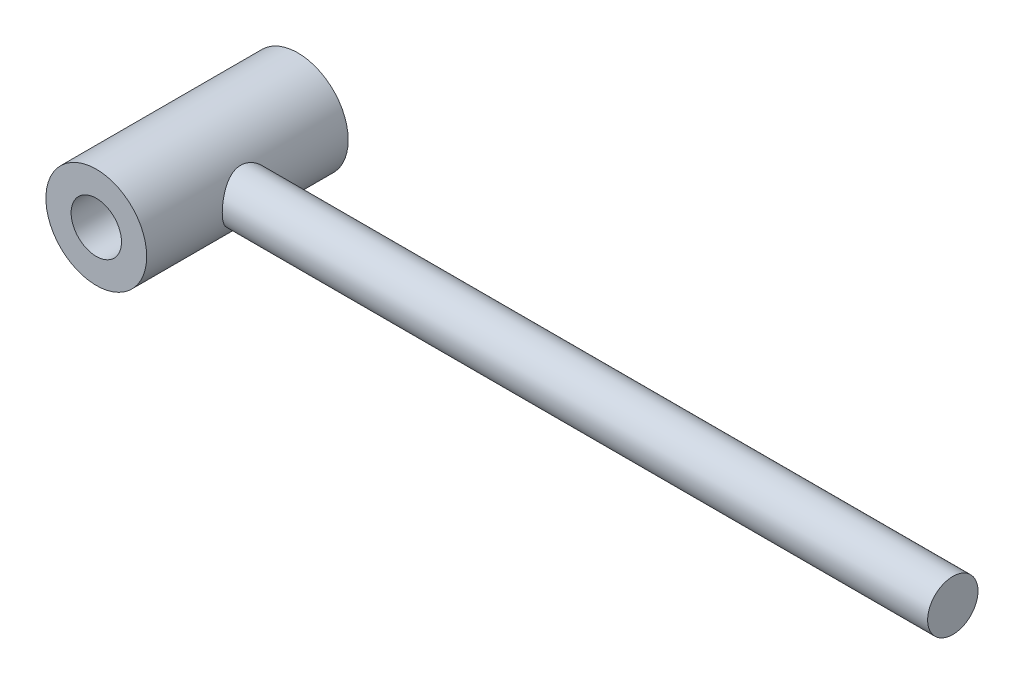
ISO-10303-21;
HEADER;
FILE_DESCRIPTION(('STEP AP214'),'2;1');
FILE_NAME('part.step','',(''),(''),'','','');
FILE_SCHEMA(('AUTOMOTIVE_DESIGN { 1 0 10303 214 1 1 1 1 }'));
ENDSEC;
DATA;
#1=APPLICATION_CONTEXT('core data for automotive mechanical design processes');
#2=APPLICATION_PROTOCOL_DEFINITION('international standard','automotive_design',2000,#1);
#3=PRODUCT_CONTEXT('',#1,'mechanical');
#4=PRODUCT('Part','Part','',(#3));
#5=PRODUCT_RELATED_PRODUCT_CATEGORY('part','',(#4));
#6=PRODUCT_DEFINITION_FORMATION('','',#4);
#7=PRODUCT_DEFINITION_CONTEXT('part definition',#1,'design');
#8=PRODUCT_DEFINITION('design','',#6,#7);
#9=PRODUCT_DEFINITION_SHAPE('','',#8);
#10=(LENGTH_UNIT() NAMED_UNIT(*) SI_UNIT(.MILLI.,.METRE.));
#11=(NAMED_UNIT(*) PLANE_ANGLE_UNIT() SI_UNIT($,.RADIAN.));
#12=(NAMED_UNIT(*) SI_UNIT($,.STERADIAN.) SOLID_ANGLE_UNIT());
#13=UNCERTAINTY_MEASURE_WITH_UNIT(LENGTH_MEASURE(1.E-05),#10,'distance_accuracy_value','');
#14=(GEOMETRIC_REPRESENTATION_CONTEXT(3) GLOBAL_UNCERTAINTY_ASSIGNED_CONTEXT((#13)) GLOBAL_UNIT_ASSIGNED_CONTEXT((#10,
#11,#12)) REPRESENTATION_CONTEXT('',''));
#15=CARTESIAN_POINT('',(0.,0.,0.));
#16=DIRECTION('',(0.,0.,1.));
#17=DIRECTION('',(1.,0.,0.));
#18=AXIS2_PLACEMENT_3D('',#15,#16,#17);
#19=CARTESIAN_POINT('',(0.,0.,20.));
#20=DIRECTION('',(0.,0.,-1.));
#21=DIRECTION('',(-1.,0.,0.));
#22=AXIS2_PLACEMENT_3D('',#19,#20,#21);
#23=CYLINDRICAL_SURFACE('',#22,5.);
#24=CARTESIAN_POINT('',(0.,0.,0.));
#25=DIRECTION('',(0.,0.,1.));
#26=DIRECTION('',(1.,0.,0.));
#27=AXIS2_PLACEMENT_3D('',#24,#25,#26);
#28=CIRCLE('',#27,5.);
#29=CARTESIAN_POINT('',(5.,0.,0.));
#30=VERTEX_POINT('',#29);
#31=EDGE_CURVE('E45',#30,#30,#28,.T.);
#32=ORIENTED_EDGE('',*,*,#31,.T.);
#33=EDGE_LOOP('',(#32));
#34=FACE_BOUND('',#33,.T.);
#35=CARTESIAN_POINT('',(0.,0.,20.));
#36=DIRECTION('',(0.,0.,1.));
#37=DIRECTION('',(1.,0.,0.));
#38=AXIS2_PLACEMENT_3D('',#35,#36,#37);
#39=CIRCLE('',#38,5.);
#40=CARTESIAN_POINT('',(5.,0.,20.));
#41=VERTEX_POINT('',#40);
#42=EDGE_CURVE('E41',#41,#41,#39,.T.);
#43=ORIENTED_EDGE('',*,*,#42,.F.);
#44=EDGE_LOOP('',(#43));
#45=FACE_BOUND('',#44,.T.);
#46=CARTESIAN_POINT('',(5.,0.,12.5));
#47=CARTESIAN_POINT('',(4.99999177550472,-0.131426682334305,12.499990330944));
#48=CARTESIAN_POINT('',(4.99476199135277,-0.263015634437212,12.489574438226));
#49=CARTESIAN_POINT('',(4.9743541856102,-0.522301454622883,12.4483681788379));
#50=CARTESIAN_POINT('',(4.9591572718767,-0.649990448564105,12.417539119075));
#51=CARTESIAN_POINT('',(4.92040690922477,-0.897333631316203,12.3370153772812));
#52=CARTESIAN_POINT('',(4.89688595907259,-1.01701694536277,12.2873940122173));
#53=CARTESIAN_POINT('',(4.84364443325827,-1.24618160399671,12.1710734737482));
#54=CARTESIAN_POINT('',(4.81392434644421,-1.3556637520377,12.1043756468549));
#55=CARTESIAN_POINT('',(4.74890645050632,-1.56876952630998,11.9512068683574));
#56=CARTESIAN_POINT('',(4.71337997659091,-1.67163802294308,11.8637837997702));
#57=CARTESIAN_POINT('',(4.64149925776731,-1.86194861703333,11.6736963040147));
#58=CARTESIAN_POINT('',(4.60514440566897,-1.94937895911555,11.5710203711599));
#59=CARTESIAN_POINT('',(4.53247377945622,-2.11312999967247,11.3437916255547));
#60=CARTESIAN_POINT('',(4.49637967412567,-2.18806333849064,11.218159753965));
#61=CARTESIAN_POINT('',(4.43214946943555,-2.31542056761491,10.9540816602046));
#62=CARTESIAN_POINT('',(4.40400769020792,-2.36786053751682,10.8156446782374));
#63=CARTESIAN_POINT('',(4.36144667591402,-2.44533110537653,10.5383372364036));
#64=CARTESIAN_POINT('',(4.34630678958452,-2.47181464267578,10.3999888698204));
#65=CARTESIAN_POINT('',(4.3295472487215,-2.50106748329741,10.1200529055624));
#66=CARTESIAN_POINT('',(4.3279142335843,-2.50386022093906,9.97846864782491));
#67=CARTESIAN_POINT('',(4.33777325642937,-2.48671821792512,9.71428493920912));
#68=CARTESIAN_POINT('',(4.34771909154984,-2.46946139884055,9.59143992194172));
#69=CARTESIAN_POINT('',(4.37690571834675,-2.41734962264384,9.35069522656806));
#70=CARTESIAN_POINT('',(4.39614947079454,-2.38248905974454,9.23279713673689));
#71=CARTESIAN_POINT('',(4.44218691031839,-2.29552445096459,9.00192716858567));
#72=CARTESIAN_POINT('',(4.46914601659993,-2.24303766778987,8.88913400303548));
#73=CARTESIAN_POINT('',(4.52758510703513,-2.12260421917012,8.67341426852503));
#74=CARTESIAN_POINT('',(4.55906711950478,-2.0546506095312,8.57049216099979));
#75=CARTESIAN_POINT('',(4.62782894758213,-1.89516513728194,8.36369686814192));
#76=CARTESIAN_POINT('',(4.66533775591865,-1.8017361459232,8.2613578160596));
#77=CARTESIAN_POINT('',(4.73869058251019,-1.59888894685344,8.07316145352275));
#78=CARTESIAN_POINT('',(4.77453379897003,-1.48946314143571,7.9873120199153));
#79=CARTESIAN_POINT('',(4.84254968207409,-1.25129126457962,7.83078584742568));
#80=CARTESIAN_POINT('',(4.87447460405015,-1.12188397899853,7.76099881888564));
#81=CARTESIAN_POINT('',(4.92894702803109,-0.851165538721985,7.64475742739248));
#82=CARTESIAN_POINT('',(4.95150197358893,-0.709863940663162,7.5982845374621));
#83=CARTESIAN_POINT('',(4.98310834353579,-0.431916229151781,7.5338114907083));
#84=CARTESIAN_POINT('',(4.9931234575324,-0.295853826370906,7.513771910633));
#85=CARTESIAN_POINT('',(5.00182533647794,-0.021948999873288,7.49633817216383));
#86=CARTESIAN_POINT('',(5.00051746803426,0.115892549675109,7.49893328590151));
#87=CARTESIAN_POINT('',(4.98727980633468,0.378082429964657,7.5255167210467));
#88=CARTESIAN_POINT('',(4.97618114219992,0.502648520123707,7.54783133182441));
#89=CARTESIAN_POINT('',(4.94555428287529,0.746017230755972,7.61059517973838));
#90=CARTESIAN_POINT('',(4.92602515837625,0.864819214231883,7.65104641613589));
#91=CARTESIAN_POINT('',(4.87960628532329,1.09722152111965,7.74999616608036));
#92=CARTESIAN_POINT('',(4.85252204417873,1.21057599249831,7.80897762528232));
#93=CARTESIAN_POINT('',(4.7935993579975,1.42615340426439,7.94276883912482));
#94=CARTESIAN_POINT('',(4.76175888940534,1.52837157450203,8.01758533651988));
#95=CARTESIAN_POINT('',(4.69270553315087,1.72941922315487,8.18940106329089));
#96=CARTESIAN_POINT('',(4.65527212009488,1.82693019428496,8.2878571709752));
#97=CARTESIAN_POINT('',(4.58155978921587,2.0046408025722,8.49981287804944));
#98=CARTESIAN_POINT('',(4.54528168472407,2.08482846428685,8.61332279706986));
#99=CARTESIAN_POINT('',(4.4762798054528,2.22926978618995,8.85910913548465));
#100=CARTESIAN_POINT('',(4.44381323981254,2.29256373922243,8.99202816529114));
#101=CARTESIAN_POINT('',(4.38935180726746,2.39520706511459,9.26877516888255));
#102=CARTESIAN_POINT('',(4.36734345549014,2.43458729077055,9.41258881599999));
#103=CARTESIAN_POINT('',(4.33903752569351,2.48465421767005,9.69227555736294));
#104=CARTESIAN_POINT('',(4.33143458674096,2.4977324874436,9.82758563411897));
#105=CARTESIAN_POINT('',(4.32913386592579,2.50172288950898,10.0986176673807));
#106=CARTESIAN_POINT('',(4.33443049025111,2.49264462983266,10.2343394198736));
#107=CARTESIAN_POINT('',(4.35594655164663,2.45481530197332,10.4887087556169));
#108=CARTESIAN_POINT('',(4.37107736338133,2.42802074302696,10.6077511817208));
#109=CARTESIAN_POINT('',(4.40927540337602,2.35793843840544,10.8395202922));
#110=CARTESIAN_POINT('',(4.43234518434965,2.31464538728732,10.9522449315665));
#111=CARTESIAN_POINT('',(4.48571326433413,2.20953919315538,11.1765621527197));
#112=CARTESIAN_POINT('',(4.5163930799845,2.14667719009403,11.287569851735));
#113=CARTESIAN_POINT('',(4.58088327077455,2.0053780838799,11.49818624324));
#114=CARTESIAN_POINT('',(4.61469526970767,1.92693287765888,11.5977889626287));
#115=CARTESIAN_POINT('',(4.68655816327011,1.74550556946065,11.7953553637496));
#116=CARTESIAN_POINT('',(4.7246249151498,1.6407002246921,11.8916493641714));
#117=CARTESIAN_POINT('',(4.79694347383545,1.41539785420684,12.065655849428));
#118=CARTESIAN_POINT('',(4.83119321905446,1.29489242426332,12.1433583186059));
#119=CARTESIAN_POINT('',(4.89245149457782,1.03978808878536,12.2780969794841));
#120=CARTESIAN_POINT('',(4.91940711437488,0.905095560782288,12.3349831677845));
#121=CARTESIAN_POINT('',(4.95177960923351,0.696328709257351,12.4021838587924));
#122=CARTESIAN_POINT('',(4.96122314081874,0.625670413494087,12.4215553980018));
#123=CARTESIAN_POINT('',(4.97717127275101,0.482623997839256,12.4540659483706));
#124=CARTESIAN_POINT('',(4.98367766823159,0.4102369630924,12.4672087666764));
#125=CARTESIAN_POINT('',(4.9923820076613,0.28151868462167,12.4847374722846));
#126=CARTESIAN_POINT('',(4.99523288466454,0.225408499555443,12.4904549365313));
#127=CARTESIAN_POINT('',(4.99904367329659,0.112875528456288,12.4980883294657));
#128=CARTESIAN_POINT('',(5.00000353273198,0.0564527338382175,12.5000041532255));
#129=CARTESIAN_POINT('',(5.,0.,12.5));
#130=B_SPLINE_CURVE_WITH_KNOTS('',3,(#46,#47,#48,#49,#50,#51,#52,#53,#54,#55,#56,#57,#58,#59,
#60,#61,#62,#63,#64,#65,#66,#67,#68,#69,#70,#71,#72,#73,#74,#75,#76,#77,#78,#79,#80,#81,#82,#83,
#84,#85,#86,#87,#88,#89,#90,#91,#92,#93,#94,#95,#96,#97,#98,#99,#100,#101,#102,#103,#104,#105,
#106,#107,#108,#109,#110,#111,#112,#113,#114,#115,#116,#117,#118,#119,#120,#121,#122,#123,#124,
#125,#126,#127,#128,#129),.UNSPECIFIED.,.T.,.F.,(4,2,2,2,2,2,2,2,2,2,2,2,2,2,2,2,2,2,2,2,2,2,2,
2,2,2,2,2,2,2,2,2,2,2,2,2,2,2,2,2,2,4),(0.,0.394060643550731,0.788870374272994,1.18215538873075,
1.57540940145392,1.99245439679522,2.40981559413509,2.85954316076882,3.30894869745702,
3.73145030350574,4.15353393322551,4.52514281023301,4.89687009814196,5.27725600421218,
5.65781303150554,6.08662353334696,6.51563836496716,6.96457555536102,7.41315542280699,
7.82458226178364,8.2358141127869,8.61517266265305,8.99457304077329,9.38482140069747,
9.77523626870848,10.2039902661037,10.6330397153795,11.0828670540368,11.53211279863,
11.9382326875699,12.3441764966107,12.7114482562151,13.0788382197025,13.4709114195009,
13.8631890285845,14.303131068923,14.7433095845248,15.1866003415819,15.407934939208,
15.6291340766843,15.7983933645035,15.9676573239323),.UNSPECIFIED.);
#131=CARTESIAN_POINT('',(5.,0.,12.5));
#132=VERTEX_POINT('',#131);
#133=EDGE_CURVE('E10',#132,#132,#130,.T.);
#134=ORIENTED_EDGE('',*,*,#133,.F.);
#135=EDGE_LOOP('',(#134));
#136=FACE_BOUND('',#135,.T.);
#137=ADVANCED_FACE('F31',(#34,#45,#136),#23,.T.);
#138=CARTESIAN_POINT('',(0.,0.,20.));
#139=DIRECTION('',(0.,0.,1.));
#140=DIRECTION('',(1.,0.,0.));
#141=AXIS2_PLACEMENT_3D('',#138,#139,#140);
#142=PLANE('',#141);
#143=ORIENTED_EDGE('',*,*,#42,.T.);
#144=EDGE_LOOP('',(#143));
#145=FACE_BOUND('',#144,.T.);
#146=CARTESIAN_POINT('',(0.,0.,20.));
#147=DIRECTION('',(0.,0.,1.));
#148=DIRECTION('',(1.,0.,0.));
#149=AXIS2_PLACEMENT_3D('',#146,#147,#148);
#150=CIRCLE('',#149,2.5);
#151=CARTESIAN_POINT('',(2.5,0.,20.));
#152=VERTEX_POINT('',#151);
#153=EDGE_CURVE('E50',#152,#152,#150,.T.);
#154=ORIENTED_EDGE('',*,*,#153,.F.);
#155=EDGE_LOOP('',(#154));
#156=FACE_BOUND('',#155,.T.);
#157=ADVANCED_FACE('F76',(#145,#156),#142,.T.);
#158=CARTESIAN_POINT('',(0.,0.,0.));
#159=DIRECTION('',(0.,0.,1.));
#160=DIRECTION('',(1.,0.,0.));
#161=AXIS2_PLACEMENT_3D('',#158,#159,#160);
#162=PLANE('',#161);
#163=ORIENTED_EDGE('',*,*,#31,.F.);
#164=EDGE_LOOP('',(#163));
#165=FACE_BOUND('',#164,.T.);
#166=CARTESIAN_POINT('',(0.,0.,0.));
#167=DIRECTION('',(0.,0.,1.));
#168=DIRECTION('',(1.,0.,0.));
#169=AXIS2_PLACEMENT_3D('',#166,#167,#168);
#170=CIRCLE('',#169,2.5);
#171=CARTESIAN_POINT('',(2.5,0.,0.));
#172=VERTEX_POINT('',#171);
#173=EDGE_CURVE('E52',#172,#172,#170,.T.);
#174=ORIENTED_EDGE('',*,*,#173,.T.);
#175=EDGE_LOOP('',(#174));
#176=FACE_BOUND('',#175,.T.);
#177=ADVANCED_FACE('F71',(#165,#176),#162,.F.);
#178=CARTESIAN_POINT('',(0.,0.,20.));
#179=DIRECTION('',(0.,0.,-1.));
#180=DIRECTION('',(-1.,0.,0.));
#181=AXIS2_PLACEMENT_3D('',#178,#179,#180);
#182=CYLINDRICAL_SURFACE('',#181,2.5);
#183=ORIENTED_EDGE('',*,*,#153,.T.);
#184=EDGE_LOOP('',(#183));
#185=FACE_BOUND('',#184,.T.);
#186=ORIENTED_EDGE('',*,*,#173,.F.);
#187=EDGE_LOOP('',(#186));
#188=FACE_BOUND('',#187,.T.);
#189=ADVANCED_FACE('F65',(#185,#188),#182,.F.);
#190=CARTESIAN_POINT('',(75.,0.,10.));
#191=DIRECTION('',(-1.,0.,0.));
#192=DIRECTION('',(0.,0.,1.));
#193=AXIS2_PLACEMENT_3D('',#190,#191,#192);
#194=CYLINDRICAL_SURFACE('',#193,2.5);
#195=CARTESIAN_POINT('',(75.,0.,10.));
#196=DIRECTION('',(1.,0.,0.));
#197=DIRECTION('',(0.,0.,-1.));
#198=AXIS2_PLACEMENT_3D('',#195,#196,#197);
#199=CIRCLE('',#198,2.5);
#200=CARTESIAN_POINT('',(75.,0.,7.5));
#201=VERTEX_POINT('',#200);
#202=EDGE_CURVE('E55',#201,#201,#199,.T.);
#203=ORIENTED_EDGE('',*,*,#202,.F.);
#204=EDGE_LOOP('',(#203));
#205=FACE_BOUND('',#204,.T.);
#206=ORIENTED_EDGE('',*,*,#133,.T.);
#207=EDGE_LOOP('',(#206));
#208=FACE_BOUND('',#207,.T.);
#209=ADVANCED_FACE('F63',(#205,#208),#194,.T.);
#210=CARTESIAN_POINT('',(75.,0.,10.));
#211=DIRECTION('',(1.,0.,0.));
#212=DIRECTION('',(0.,0.,-1.));
#213=AXIS2_PLACEMENT_3D('',#210,#211,#212);
#214=PLANE('',#213);
#215=ORIENTED_EDGE('',*,*,#202,.T.);
#216=EDGE_LOOP('',(#215));
#217=FACE_BOUND('',#216,.T.);
#218=ADVANCED_FACE('F61',(#217),#214,.T.);
#219=CLOSED_SHELL('',(#137,#157,#177,#189,#209,#218));
#220=MANIFOLD_SOLID_BREP('B2',#219);
#221=ADVANCED_BREP_SHAPE_REPRESENTATION('',(#18,#220),#14);
#222=SHAPE_DEFINITION_REPRESENTATION(#9,#221);
ENDSEC;
END-ISO-10303-21;
